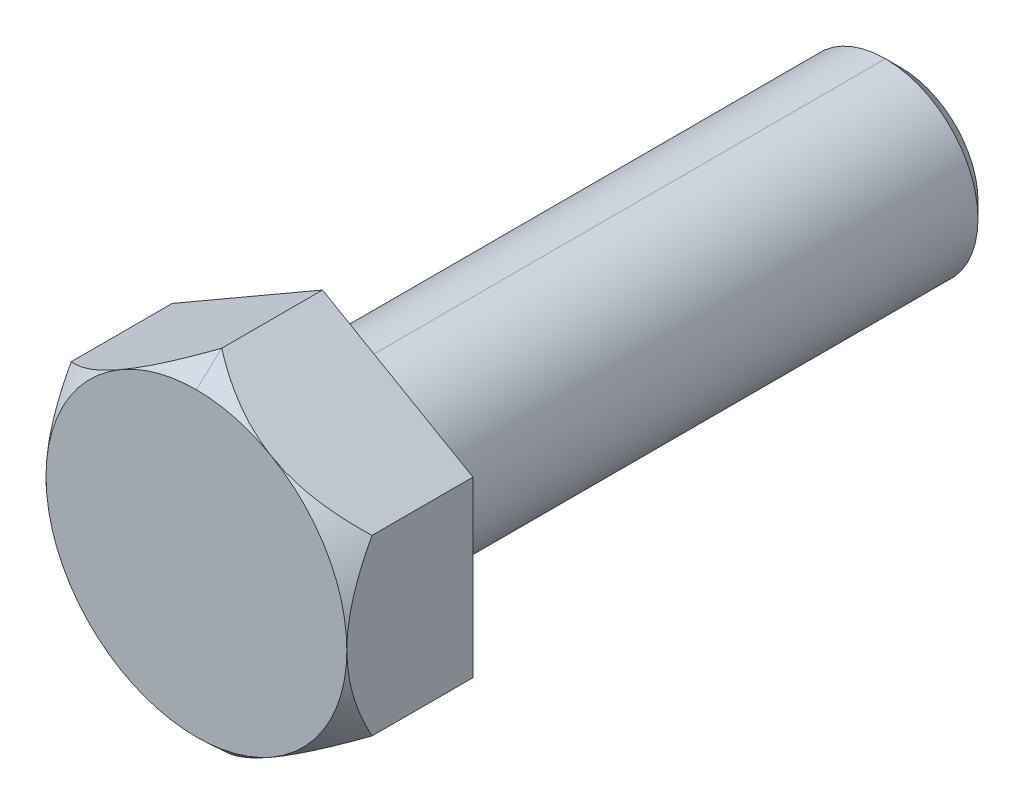
ISO-10303-21;
HEADER;
FILE_DESCRIPTION(('STEP AP214'),'2;1');
FILE_NAME('part.step','',(''),(''),'','','');
FILE_SCHEMA(('AUTOMOTIVE_DESIGN { 1 0 10303 214 1 1 1 1 }'));
ENDSEC;
DATA;
#1=APPLICATION_CONTEXT('core data for automotive mechanical design processes');
#2=APPLICATION_PROTOCOL_DEFINITION('international standard','automotive_design',2000,#1);
#3=PRODUCT_CONTEXT('',#1,'mechanical');
#4=PRODUCT('Part','Part','',(#3));
#5=PRODUCT_RELATED_PRODUCT_CATEGORY('part','',(#4));
#6=PRODUCT_DEFINITION_FORMATION('','',#4);
#7=PRODUCT_DEFINITION_CONTEXT('part definition',#1,'design');
#8=PRODUCT_DEFINITION('design','',#6,#7);
#9=PRODUCT_DEFINITION_SHAPE('','',#8);
#10=(LENGTH_UNIT() NAMED_UNIT(*) SI_UNIT(.MILLI.,.METRE.));
#11=(NAMED_UNIT(*) PLANE_ANGLE_UNIT() SI_UNIT($,.RADIAN.));
#12=(NAMED_UNIT(*) SI_UNIT($,.STERADIAN.) SOLID_ANGLE_UNIT());
#13=UNCERTAINTY_MEASURE_WITH_UNIT(LENGTH_MEASURE(1.E-05),#10,'distance_accuracy_value','');
#14=(GEOMETRIC_REPRESENTATION_CONTEXT(3) GLOBAL_UNCERTAINTY_ASSIGNED_CONTEXT((#13)) GLOBAL_UNIT_ASSIGNED_CONTEXT((#10,
#11,#12)) REPRESENTATION_CONTEXT('',''));
#15=CARTESIAN_POINT('',(0.,0.,0.));
#16=DIRECTION('',(0.,0.,1.));
#17=DIRECTION('',(1.,0.,0.));
#18=AXIS2_PLACEMENT_3D('',#15,#16,#17);
#19=CARTESIAN_POINT('',(0.,1.66171875,-25.));
#20=DIRECTION('',(0.,0.,-1.));
#21=DIRECTION('',(0.,-1.,0.));
#22=AXIS2_PLACEMENT_3D('',#19,#20,#21);
#23=PLANE('',#22);
#24=CARTESIAN_POINT('',(0.,0.,-25.));
#25=DIRECTION('',(0.,0.,-1.));
#26=DIRECTION('',(0.,1.,0.));
#27=AXIS2_PLACEMENT_3D('',#24,#25,#26);
#28=CIRCLE('',#27,3.3234375);
#29=CARTESIAN_POINT('',(0.,3.3234375,-25.));
#30=VERTEX_POINT('',#29);
#31=CARTESIAN_POINT('',(0.,-3.3234375,-25.));
#32=VERTEX_POINT('',#31);
#33=EDGE_CURVE('E250',#30,#32,#28,.T.);
#34=ORIENTED_EDGE('',*,*,#33,.T.);
#35=CARTESIAN_POINT('',(0.,0.,-25.));
#36=DIRECTION('',(0.,0.,-1.));
#37=DIRECTION('',(0.,1.,0.));
#38=AXIS2_PLACEMENT_3D('',#35,#36,#37);
#39=CIRCLE('',#38,3.3234375);
#40=EDGE_CURVE('E10',#32,#30,#39,.T.);
#41=ORIENTED_EDGE('',*,*,#40,.T.);
#42=EDGE_LOOP('',(#34,#41));
#43=FACE_BOUND('',#42,.T.);
#44=ADVANCED_FACE('F15',(#43),#23,.T.);
#45=CARTESIAN_POINT('',(0.,0.,-24.66171875));
#46=DIRECTION('',(0.,0.,1.));
#47=DIRECTION('',(0.,1.,0.));
#48=AXIS2_PLACEMENT_3D('',#45,#46,#47);
#49=CONICAL_SURFACE('',#48,3.66171875,0.785398163397449);
#50=DIRECTION('',(0.,-0.707106781186548,-0.707106781186547));
#51=VECTOR('',#50,1.);
#52=CARTESIAN_POINT('',(0.,3.66171875,-24.66171875));
#53=LINE('',#52,#51);
#54=CARTESIAN_POINT('',(0.,4.,-24.3234375));
#55=VERTEX_POINT('',#54);
#56=EDGE_CURVE('E247',#55,#30,#53,.T.);
#57=ORIENTED_EDGE('',*,*,#56,.T.);
#58=ORIENTED_EDGE('',*,*,#40,.F.);
#59=DIRECTION('',(0.,-0.707106781186548,0.707106781186547));
#60=VECTOR('',#59,1.);
#61=CARTESIAN_POINT('',(0.,-3.66171875,-24.66171875));
#62=LINE('',#61,#60);
#63=CARTESIAN_POINT('',(0.,-4.,-24.3234375));
#64=VERTEX_POINT('',#63);
#65=EDGE_CURVE('E19',#32,#64,#62,.T.);
#66=ORIENTED_EDGE('',*,*,#65,.T.);
#67=CARTESIAN_POINT('',(0.,0.,-24.3234375));
#68=DIRECTION('',(0.,0.,-1.));
#69=DIRECTION('',(0.,1.,0.));
#70=AXIS2_PLACEMENT_3D('',#67,#68,#69);
#71=CIRCLE('',#70,4.);
#72=EDGE_CURVE('E26',#64,#55,#71,.T.);
#73=ORIENTED_EDGE('',*,*,#72,.T.);
#74=EDGE_LOOP('',(#57,#58,#66,#73));
#75=FACE_BOUND('',#74,.T.);
#76=ADVANCED_FACE('F17',(#75),#49,.T.);
#77=CARTESIAN_POINT('',(0.,0.,-12.36171875));
#78=DIRECTION('',(0.,0.,-1.));
#79=DIRECTION('',(0.,1.,0.));
#80=AXIS2_PLACEMENT_3D('',#77,#78,#79);
#81=CYLINDRICAL_SURFACE('',#80,4.);
#82=DIRECTION('',(0.,0.,-1.));
#83=VECTOR('',#82,1.);
#84=CARTESIAN_POINT('',(0.,4.,-12.36171875));
#85=LINE('',#84,#83);
#86=CARTESIAN_POINT('',(0.,4.,-0.4));
#87=VERTEX_POINT('',#86);
#88=EDGE_CURVE('E200',#87,#55,#85,.T.);
#89=ORIENTED_EDGE('',*,*,#88,.T.);
#90=ORIENTED_EDGE('',*,*,#72,.F.);
#91=DIRECTION('',(0.,0.,1.));
#92=VECTOR('',#91,1.);
#93=CARTESIAN_POINT('',(0.,-4.,-12.36171875));
#94=LINE('',#93,#92);
#95=CARTESIAN_POINT('',(0.,-4.,-0.4));
#96=VERTEX_POINT('',#95);
#97=EDGE_CURVE('E180',#64,#96,#94,.T.);
#98=ORIENTED_EDGE('',*,*,#97,.T.);
#99=CARTESIAN_POINT('',(0.,0.,-0.4));
#100=DIRECTION('',(0.,0.,-1.));
#101=DIRECTION('',(0.,1.,0.));
#102=AXIS2_PLACEMENT_3D('',#99,#100,#101);
#103=CIRCLE('',#102,4.);
#104=CARTESIAN_POINT('',(-4.,0.,-0.4));
#105=VERTEX_POINT('',#104);
#106=EDGE_CURVE('E222',#96,#105,#103,.T.);
#107=ORIENTED_EDGE('',*,*,#106,.T.);
#108=CARTESIAN_POINT('',(0.,0.,-0.4));
#109=DIRECTION('',(0.,0.,-1.));
#110=DIRECTION('',(0.,1.,0.));
#111=AXIS2_PLACEMENT_3D('',#108,#109,#110);
#112=CIRCLE('',#111,4.);
#113=EDGE_CURVE('E335',#105,#87,#112,.T.);
#114=ORIENTED_EDGE('',*,*,#113,.T.);
#115=EDGE_LOOP('',(#89,#90,#98,#107,#114));
#116=FACE_BOUND('',#115,.T.);
#117=ADVANCED_FACE('F454',(#116),#81,.T.);
#118=CARTESIAN_POINT('',(0.,0.,-0.4));
#119=DIRECTION('',(0.,0.,-1.));
#120=DIRECTION('',(-1.,0.,0.));
#121=AXIS2_PLACEMENT_3D('',#118,#119,#120);
#122=TOROIDAL_SURFACE('',#121,4.4,0.4);
#123=CARTESIAN_POINT('',(4.4,0.,-0.4));
#124=DIRECTION('',(0.,-1.,0.));
#125=DIRECTION('',(1.,0.,0.));
#126=AXIS2_PLACEMENT_3D('',#123,#124,#125);
#127=CIRCLE('',#126,0.4);
#128=CARTESIAN_POINT('',(4.4,0.,0.));
#129=VERTEX_POINT('',#128);
#130=CARTESIAN_POINT('',(4.,0.,-0.4));
#131=VERTEX_POINT('',#130);
#132=EDGE_CURVE('E160',#129,#131,#127,.T.);
#133=ORIENTED_EDGE('',*,*,#132,.T.);
#134=CARTESIAN_POINT('',(0.,0.,-0.4));
#135=DIRECTION('',(0.,0.,-1.));
#136=DIRECTION('',(0.,1.,0.));
#137=AXIS2_PLACEMENT_3D('',#134,#135,#136);
#138=CIRCLE('',#137,4.);
#139=EDGE_CURVE('E197',#87,#131,#138,.T.);
#140=ORIENTED_EDGE('',*,*,#139,.F.);
#141=ORIENTED_EDGE('',*,*,#113,.F.);
#142=CARTESIAN_POINT('',(-4.4,0.,-0.4));
#143=DIRECTION('',(0.,-1.,0.));
#144=DIRECTION('',(-1.,0.,0.));
#145=AXIS2_PLACEMENT_3D('',#142,#143,#144);
#146=CIRCLE('',#145,0.4);
#147=CARTESIAN_POINT('',(-4.4,0.,0.));
#148=VERTEX_POINT('',#147);
#149=EDGE_CURVE('E173',#105,#148,#146,.T.);
#150=ORIENTED_EDGE('',*,*,#149,.T.);
#151=CARTESIAN_POINT('',(0.,0.,0.));
#152=DIRECTION('',(0.,0.,-1.));
#153=DIRECTION('',(0.,1.,0.));
#154=AXIS2_PLACEMENT_3D('',#151,#152,#153);
#155=CIRCLE('',#154,4.4);
#156=CARTESIAN_POINT('',(0.,4.4,0.));
#157=VERTEX_POINT('',#156);
#158=EDGE_CURVE('E39',#148,#157,#155,.T.);
#159=ORIENTED_EDGE('',*,*,#158,.T.);
#160=CARTESIAN_POINT('',(0.,0.,0.));
#161=DIRECTION('',(0.,0.,-1.));
#162=DIRECTION('',(0.,1.,0.));
#163=AXIS2_PLACEMENT_3D('',#160,#161,#162);
#164=CIRCLE('',#163,4.4);
#165=EDGE_CURVE('E155',#157,#129,#164,.T.);
#166=ORIENTED_EDGE('',*,*,#165,.T.);
#167=EDGE_LOOP('',(#133,#140,#141,#150,#159,#166));
#168=FACE_BOUND('',#167,.T.);
#169=ADVANCED_FACE('F157',(#168),#122,.F.);
#170=CARTESIAN_POINT('',(0.,0.,4.905));
#171=DIRECTION('',(0.,0.,-1.));
#172=DIRECTION('',(0.,1.,0.));
#173=AXIS2_PLACEMENT_3D('',#170,#171,#172);
#174=CONICAL_SURFACE('',#173,7.002775,0.745120275929383);
#175=DIRECTION('',(0.,0.678060218932267,-0.735006353374939));
#176=VECTOR('',#175,1.);
#177=CARTESIAN_POINT('',(0.,7.002775,4.905));
#178=LINE('',#177,#176);
#179=CARTESIAN_POINT('',(0.,6.5,5.45));
#180=VERTEX_POINT('',#179);
#181=CARTESIAN_POINT('',(0.,7.50554999999755,4.36));
#182=VERTEX_POINT('',#181);
#183=EDGE_CURVE('E217',#180,#182,#178,.T.);
#184=ORIENTED_EDGE('',*,*,#183,.T.);
#185=CARTESIAN_POINT('',(-6.49999393874435,3.75278024920015,4.36));
#186=CARTESIAN_POINT('',(-4.75832781303399,4.75833165571747,5.45));
#187=CARTESIAN_POINT('',(-3.25,5.62916512459885,5.45));
#188=CARTESIAN_POINT('',(-1.74167218696601,6.49999859348022,5.45));
#189=CARTESIAN_POINT('',(-6.0612556537463E-06,7.50554999999755,4.36));
#190=(BOUNDED_CURVE() B_SPLINE_CURVE(2,(#185,#186,#187,#188,#189),.UNSPECIFIED.,.F.,
.F.) B_SPLINE_CURVE_WITH_KNOTS((3,2,3),(0.,3.93923247027005,7.87846494054011),
.UNSPECIFIED.) CURVE() GEOMETRIC_REPRESENTATION_ITEM() RATIONAL_B_SPLINE_CURVE((1.,
1.03795471962896,1.,1.03795471962895,1.)) REPRESENTATION_ITEM(''));
#191=CARTESIAN_POINT('',(-3.25,5.62916512459885,5.45));
#192=VERTEX_POINT('',#191);
#193=EDGE_CURVE('E215',#192,#182,#190,.T.);
#194=ORIENTED_EDGE('',*,*,#193,.F.);
#195=CARTESIAN_POINT('',(0.,0.,5.45));
#196=DIRECTION('',(0.,0.,-1.));
#197=DIRECTION('',(0.,1.,0.));
#198=AXIS2_PLACEMENT_3D('',#195,#196,#197);
#199=CIRCLE('',#198,6.5);
#200=EDGE_CURVE('E332',#192,#180,#199,.T.);
#201=ORIENTED_EDGE('',*,*,#200,.T.);
#202=EDGE_LOOP('',(#184,#194,#201));
#203=FACE_BOUND('',#202,.T.);
#204=ADVANCED_FACE('F481',(#203),#174,.T.);
#205=CARTESIAN_POINT('',(0.,3.25,5.45));
#206=DIRECTION('',(0.,0.,1.));
#207=DIRECTION('',(0.,-1.,0.));
#208=AXIS2_PLACEMENT_3D('',#205,#206,#207);
#209=PLANE('',#208);
#210=ORIENTED_EDGE('',*,*,#200,.F.);
#211=CARTESIAN_POINT('',(0.,0.,5.45));
#212=DIRECTION('',(0.,0.,-1.));
#213=DIRECTION('',(0.,1.,0.));
#214=AXIS2_PLACEMENT_3D('',#211,#212,#213);
#215=CIRCLE('',#214,6.5);
#216=CARTESIAN_POINT('',(-6.5,0.,5.45));
#217=VERTEX_POINT('',#216);
#218=EDGE_CURVE('E288',#217,#192,#215,.T.);
#219=ORIENTED_EDGE('',*,*,#218,.F.);
#220=CARTESIAN_POINT('',(0.,0.,5.45));
#221=DIRECTION('',(0.,0.,-1.));
#222=DIRECTION('',(0.,1.,0.));
#223=AXIS2_PLACEMENT_3D('',#220,#221,#222);
#224=CIRCLE('',#223,6.5);
#225=CARTESIAN_POINT('',(-3.25,-5.62916512459885,5.45));
#226=VERTEX_POINT('',#225);
#227=EDGE_CURVE('E390',#226,#217,#224,.T.);
#228=ORIENTED_EDGE('',*,*,#227,.F.);
#229=CARTESIAN_POINT('',(0.,0.,5.45));
#230=DIRECTION('',(0.,0.,-1.));
#231=DIRECTION('',(0.,1.,0.));
#232=AXIS2_PLACEMENT_3D('',#229,#230,#231);
#233=CIRCLE('',#232,6.5);
#234=CARTESIAN_POINT('',(0.,-6.5,5.45));
#235=VERTEX_POINT('',#234);
#236=EDGE_CURVE('E367',#235,#226,#233,.T.);
#237=ORIENTED_EDGE('',*,*,#236,.F.);
#238=CARTESIAN_POINT('',(0.,0.,5.45));
#239=DIRECTION('',(0.,0.,-1.));
#240=DIRECTION('',(0.,1.,0.));
#241=AXIS2_PLACEMENT_3D('',#238,#239,#240);
#242=CIRCLE('',#241,6.5);
#243=CARTESIAN_POINT('',(3.25,-5.62916512459885,5.45));
#244=VERTEX_POINT('',#243);
#245=EDGE_CURVE('E280',#244,#235,#242,.T.);
#246=ORIENTED_EDGE('',*,*,#245,.F.);
#247=CARTESIAN_POINT('',(0.,0.,5.45));
#248=DIRECTION('',(0.,0.,-1.));
#249=DIRECTION('',(0.,1.,0.));
#250=AXIS2_PLACEMENT_3D('',#247,#248,#249);
#251=CIRCLE('',#250,6.5);
#252=CARTESIAN_POINT('',(6.5,0.,5.45));
#253=VERTEX_POINT('',#252);
#254=EDGE_CURVE('E293',#253,#244,#251,.T.);
#255=ORIENTED_EDGE('',*,*,#254,.F.);
#256=CARTESIAN_POINT('',(0.,0.,5.45));
#257=DIRECTION('',(0.,0.,-1.));
#258=DIRECTION('',(0.,1.,0.));
#259=AXIS2_PLACEMENT_3D('',#256,#257,#258);
#260=CIRCLE('',#259,6.5);
#261=CARTESIAN_POINT('',(3.25,5.62916512459885,5.45));
#262=VERTEX_POINT('',#261);
#263=EDGE_CURVE('E292',#262,#253,#260,.T.);
#264=ORIENTED_EDGE('',*,*,#263,.F.);
#265=CARTESIAN_POINT('',(0.,0.,5.45));
#266=DIRECTION('',(0.,0.,-1.));
#267=DIRECTION('',(0.,1.,0.));
#268=AXIS2_PLACEMENT_3D('',#265,#266,#267);
#269=CIRCLE('',#268,6.5);
#270=EDGE_CURVE('E221',#180,#262,#269,.T.);
#271=ORIENTED_EDGE('',*,*,#270,.F.);
#272=EDGE_LOOP('',(#210,#219,#228,#237,#246,#255,#264,#271));
#273=FACE_BOUND('',#272,.T.);
#274=ADVANCED_FACE('F384',(#273),#209,.T.);
#275=CARTESIAN_POINT('',(0.,0.,4.905));
#276=DIRECTION('',(0.,0.,-1.));
#277=DIRECTION('',(0.,1.,0.));
#278=AXIS2_PLACEMENT_3D('',#275,#276,#277);
#279=CONICAL_SURFACE('',#278,7.002775,0.745120275929383);
#280=CARTESIAN_POINT('',(6.0612556489286E-06,7.50554999999755,4.36));
#281=CARTESIAN_POINT('',(1.74167218696601,6.49999859348022,5.45));
#282=CARTESIAN_POINT('',(3.25,5.62916512459885,5.45));
#283=CARTESIAN_POINT('',(4.75832781303399,4.75833165571748,5.45));
#284=CARTESIAN_POINT('',(6.49999393874435,3.75278024920015,4.36));
#285=(BOUNDED_CURVE() B_SPLINE_CURVE(2,(#280,#281,#282,#283,#284),.UNSPECIFIED.,.F.,
.F.) B_SPLINE_CURVE_WITH_KNOTS((3,2,3),(0.,3.93923247027005,7.8784649405401),
.UNSPECIFIED.) CURVE() GEOMETRIC_REPRESENTATION_ITEM() RATIONAL_B_SPLINE_CURVE((1.,
1.03795471962894,1.,1.03795471962894,1.)) REPRESENTATION_ITEM(''));
#286=CARTESIAN_POINT('',(6.49999696937217,3.75277499999878,4.36));
#287=VERTEX_POINT('',#286);
#288=EDGE_CURVE('E207',#262,#287,#285,.T.);
#289=ORIENTED_EDGE('',*,*,#288,.F.);
#290=ORIENTED_EDGE('',*,*,#263,.T.);
#291=CARTESIAN_POINT('',(6.5,3.75276975079741,4.36));
#292=CARTESIAN_POINT('',(6.5,1.74166693776276,5.45));
#293=CARTESIAN_POINT('',(6.5,0.,5.45));
#294=CARTESIAN_POINT('',(6.50000000000001,-1.74166693776275,5.45));
#295=CARTESIAN_POINT('',(6.5,-3.7527697507974,4.36));
#296=(BOUNDED_CURVE() B_SPLINE_CURVE(2,(#291,#292,#293,#294,#295),.UNSPECIFIED.,.F.,
.F.) B_SPLINE_CURVE_WITH_KNOTS((3,2,3),(0.,3.93923247027006,7.87846494054011),
.UNSPECIFIED.) CURVE() GEOMETRIC_REPRESENTATION_ITEM() RATIONAL_B_SPLINE_CURVE((1.,
1.03795471962894,1.,1.03795471962895,1.)) REPRESENTATION_ITEM(''));
#297=EDGE_CURVE('E201',#287,#253,#296,.T.);
#298=ORIENTED_EDGE('',*,*,#297,.F.);
#299=EDGE_LOOP('',(#289,#290,#298));
#300=FACE_BOUND('',#299,.T.);
#301=ADVANCED_FACE('F380',(#300),#279,.T.);
#302=CARTESIAN_POINT('',(0.,0.,4.905));
#303=DIRECTION('',(0.,0.,-1.));
#304=DIRECTION('',(0.,1.,0.));
#305=AXIS2_PLACEMENT_3D('',#302,#303,#304);
#306=CONICAL_SURFACE('',#305,7.002775,0.745120275929383);
#307=CARTESIAN_POINT('',(-6.5,-3.7527697507974,4.36));
#308=CARTESIAN_POINT('',(-6.50000000000001,-1.74166693776275,5.45));
#309=CARTESIAN_POINT('',(-6.5,0.,5.45));
#310=CARTESIAN_POINT('',(-6.50000000000001,1.74166693776275,5.45));
#311=CARTESIAN_POINT('',(-6.5,3.7527697507974,4.36));
#312=(BOUNDED_CURVE() B_SPLINE_CURVE(2,(#307,#308,#309,#310,#311),.UNSPECIFIED.,.F.,
.F.) B_SPLINE_CURVE_WITH_KNOTS((3,2,3),(0.,3.93923247027005,7.8784649405401),
.UNSPECIFIED.) CURVE() GEOMETRIC_REPRESENTATION_ITEM() RATIONAL_B_SPLINE_CURVE((1.,
1.03795471962893,1.,1.03795471962893,1.)) REPRESENTATION_ITEM(''));
#313=CARTESIAN_POINT('',(-6.49999696937218,3.75277499999878,4.36));
#314=VERTEX_POINT('',#313);
#315=EDGE_CURVE('E321',#217,#314,#312,.T.);
#316=ORIENTED_EDGE('',*,*,#315,.F.);
#317=ORIENTED_EDGE('',*,*,#218,.T.);
#318=CARTESIAN_POINT('',(-6.49999393874435,3.75278024920015,4.36));
#319=CARTESIAN_POINT('',(-4.75832781303399,4.75833165571747,5.45));
#320=CARTESIAN_POINT('',(-3.25,5.62916512459885,5.45));
#321=CARTESIAN_POINT('',(-1.74167218696601,6.49999859348022,5.45));
#322=CARTESIAN_POINT('',(-6.0612556537463E-06,7.50554999999755,4.36));
#323=(BOUNDED_CURVE() B_SPLINE_CURVE(2,(#318,#319,#320,#321,#322),.UNSPECIFIED.,.F.,
.F.) B_SPLINE_CURVE_WITH_KNOTS((3,2,3),(0.,3.93923247027005,7.87846494054011),
.UNSPECIFIED.) CURVE() GEOMETRIC_REPRESENTATION_ITEM() RATIONAL_B_SPLINE_CURVE((1.,
1.03795471962896,1.,1.03795471962895,1.)) REPRESENTATION_ITEM(''));
#324=EDGE_CURVE('E287',#314,#192,#323,.T.);
#325=ORIENTED_EDGE('',*,*,#324,.F.);
#326=EDGE_LOOP('',(#316,#317,#325));
#327=FACE_BOUND('',#326,.T.);
#328=ADVANCED_FACE('F466',(#327),#306,.T.);
#329=CARTESIAN_POINT('',(0.,0.,4.905));
#330=DIRECTION('',(0.,0.,-1.));
#331=DIRECTION('',(0.,1.,0.));
#332=AXIS2_PLACEMENT_3D('',#329,#330,#331);
#333=CONICAL_SURFACE('',#332,7.002775,0.745120275929383);
#334=CARTESIAN_POINT('',(6.5,3.75276975079741,4.36));
#335=CARTESIAN_POINT('',(6.5,1.74166693776276,5.45));
#336=CARTESIAN_POINT('',(6.5,0.,5.45));
#337=CARTESIAN_POINT('',(6.50000000000001,-1.74166693776275,5.45));
#338=CARTESIAN_POINT('',(6.5,-3.7527697507974,4.36));
#339=(BOUNDED_CURVE() B_SPLINE_CURVE(2,(#334,#335,#336,#337,#338),.UNSPECIFIED.,.F.,
.F.) B_SPLINE_CURVE_WITH_KNOTS((3,2,3),(0.,3.93923247027006,7.87846494054011),
.UNSPECIFIED.) CURVE() GEOMETRIC_REPRESENTATION_ITEM() RATIONAL_B_SPLINE_CURVE((1.,
1.03795471962894,1.,1.03795471962895,1.)) REPRESENTATION_ITEM(''));
#340=CARTESIAN_POINT('',(6.49999696937217,-3.75277499999878,4.36));
#341=VERTEX_POINT('',#340);
#342=EDGE_CURVE('E196',#253,#341,#339,.T.);
#343=ORIENTED_EDGE('',*,*,#342,.F.);
#344=ORIENTED_EDGE('',*,*,#254,.T.);
#345=CARTESIAN_POINT('',(6.49999393874435,-3.75278024920015,4.36));
#346=CARTESIAN_POINT('',(4.75832781303399,-4.75833165571748,5.45));
#347=CARTESIAN_POINT('',(3.25,-5.62916512459885,5.45));
#348=CARTESIAN_POINT('',(1.74167218696601,-6.49999859348022,5.45));
#349=CARTESIAN_POINT('',(6.06125565273639E-06,-7.50554999999755,4.36));
#350=(BOUNDED_CURVE() B_SPLINE_CURVE(2,(#345,#346,#347,#348,#349),.UNSPECIFIED.,.F.,
.F.) B_SPLINE_CURVE_WITH_KNOTS((3,2,3),(0.,3.93923247027005,7.87846494054011),
.UNSPECIFIED.) CURVE() GEOMETRIC_REPRESENTATION_ITEM() RATIONAL_B_SPLINE_CURVE((1.,
1.03795471962894,1.,1.03795471962893,1.)) REPRESENTATION_ITEM(''));
#351=EDGE_CURVE('E260',#341,#244,#350,.T.);
#352=ORIENTED_EDGE('',*,*,#351,.F.);
#353=EDGE_LOOP('',(#343,#344,#352));
#354=FACE_BOUND('',#353,.T.);
#355=ADVANCED_FACE('F396',(#354),#333,.T.);
#356=CARTESIAN_POINT('',(0.,0.,4.905));
#357=DIRECTION('',(0.,0.,-1.));
#358=DIRECTION('',(0.,1.,0.));
#359=AXIS2_PLACEMENT_3D('',#356,#357,#358);
#360=CONICAL_SURFACE('',#359,7.002775,0.745120275929383);
#361=CARTESIAN_POINT('',(-6.5,-3.7527697507974,4.36));
#362=CARTESIAN_POINT('',(-6.50000000000001,-1.74166693776275,5.45));
#363=CARTESIAN_POINT('',(-6.5,0.,5.45));
#364=CARTESIAN_POINT('',(-6.50000000000001,1.74166693776275,5.45));
#365=CARTESIAN_POINT('',(-6.5,3.7527697507974,4.36));
#366=(BOUNDED_CURVE() B_SPLINE_CURVE(2,(#361,#362,#363,#364,#365),.UNSPECIFIED.,.F.,
.F.) B_SPLINE_CURVE_WITH_KNOTS((3,2,3),(0.,3.93923247027005,7.8784649405401),
.UNSPECIFIED.) CURVE() GEOMETRIC_REPRESENTATION_ITEM() RATIONAL_B_SPLINE_CURVE((1.,
1.03795471962893,1.,1.03795471962893,1.)) REPRESENTATION_ITEM(''));
#367=CARTESIAN_POINT('',(-6.49999696937217,-3.75277499999878,4.36));
#368=VERTEX_POINT('',#367);
#369=EDGE_CURVE('E229',#368,#217,#366,.T.);
#370=ORIENTED_EDGE('',*,*,#369,.F.);
#371=CARTESIAN_POINT('',(-6.06125564660671E-06,-7.50554999999755,4.36));
#372=CARTESIAN_POINT('',(-1.741672186966,-6.49999859348023,5.45));
#373=CARTESIAN_POINT('',(-3.25,-5.62916512459885,5.45));
#374=CARTESIAN_POINT('',(-4.75832781303399,-4.75833165571747,5.45));
#375=CARTESIAN_POINT('',(-6.49999393874435,-3.75278024920015,4.36));
#376=(BOUNDED_CURVE() B_SPLINE_CURVE(2,(#371,#372,#373,#374,#375),.UNSPECIFIED.,.F.,
.F.) B_SPLINE_CURVE_WITH_KNOTS((3,2,3),(0.,3.93923247027006,7.87846494054012),
.UNSPECIFIED.) CURVE() GEOMETRIC_REPRESENTATION_ITEM() RATIONAL_B_SPLINE_CURVE((1.,
1.03795471962894,1.,1.03795471962894,1.)) REPRESENTATION_ITEM(''));
#377=EDGE_CURVE('E238',#226,#368,#376,.T.);
#378=ORIENTED_EDGE('',*,*,#377,.F.);
#379=ORIENTED_EDGE('',*,*,#227,.T.);
#380=EDGE_LOOP('',(#370,#378,#379));
#381=FACE_BOUND('',#380,.T.);
#382=ADVANCED_FACE('F459',(#381),#360,.T.);
#383=CARTESIAN_POINT('',(0.,0.,4.905));
#384=DIRECTION('',(0.,0.,-1.));
#385=DIRECTION('',(0.,1.,0.));
#386=AXIS2_PLACEMENT_3D('',#383,#384,#385);
#387=CONICAL_SURFACE('',#386,7.002775,0.745120275929383);
#388=DIRECTION('',(0.,0.678060218932267,0.735006353374939));
#389=VECTOR('',#388,1.);
#390=CARTESIAN_POINT('',(0.,-7.002775,4.905));
#391=LINE('',#390,#389);
#392=CARTESIAN_POINT('',(0.,-7.50554999999755,4.36));
#393=VERTEX_POINT('',#392);
#394=EDGE_CURVE('E188',#393,#235,#391,.T.);
#395=ORIENTED_EDGE('',*,*,#394,.T.);
#396=ORIENTED_EDGE('',*,*,#236,.T.);
#397=CARTESIAN_POINT('',(-6.06125564660671E-06,-7.50554999999755,4.36));
#398=CARTESIAN_POINT('',(-1.741672186966,-6.49999859348023,5.45));
#399=CARTESIAN_POINT('',(-3.25,-5.62916512459885,5.45));
#400=CARTESIAN_POINT('',(-4.75832781303399,-4.75833165571747,5.45));
#401=CARTESIAN_POINT('',(-6.49999393874435,-3.75278024920015,4.36));
#402=(BOUNDED_CURVE() B_SPLINE_CURVE(2,(#397,#398,#399,#400,#401),.UNSPECIFIED.,.F.,
.F.) B_SPLINE_CURVE_WITH_KNOTS((3,2,3),(0.,3.93923247027006,7.87846494054012),
.UNSPECIFIED.) CURVE() GEOMETRIC_REPRESENTATION_ITEM() RATIONAL_B_SPLINE_CURVE((1.,
1.03795471962894,1.,1.03795471962894,1.)) REPRESENTATION_ITEM(''));
#403=EDGE_CURVE('E164',#393,#226,#402,.T.);
#404=ORIENTED_EDGE('',*,*,#403,.F.);
#405=EDGE_LOOP('',(#395,#396,#404));
#406=FACE_BOUND('',#405,.T.);
#407=ADVANCED_FACE('F462',(#406),#387,.T.);
#408=CARTESIAN_POINT('',(0.,5.952775,0.));
#409=DIRECTION('',(0.,0.,-1.));
#410=DIRECTION('',(0.,-1.,0.));
#411=AXIS2_PLACEMENT_3D('',#408,#409,#410);
#412=PLANE('',#411);
#413=ORIENTED_EDGE('',*,*,#165,.F.);
#414=ORIENTED_EDGE('',*,*,#158,.F.);
#415=CARTESIAN_POINT('',(0.,0.,0.));
#416=DIRECTION('',(0.,0.,-1.));
#417=DIRECTION('',(0.,1.,0.));
#418=AXIS2_PLACEMENT_3D('',#415,#416,#417);
#419=CIRCLE('',#418,4.4);
#420=EDGE_CURVE('E167',#129,#148,#419,.T.);
#421=ORIENTED_EDGE('',*,*,#420,.F.);
#422=EDGE_LOOP('',(#413,#414,#421));
#423=FACE_BOUND('',#422,.T.);
#424=DIRECTION('',(-0.866025403784439,0.5,0.));
#425=VECTOR('',#424,1.);
#426=CARTESIAN_POINT('',(1.96118640674677,6.37326199959885,0.));
#427=LINE('',#426,#425);
#428=CARTESIAN_POINT('',(6.49999696937217,3.75277499999878,0.));
#429=VERTEX_POINT('',#428);
#430=CARTESIAN_POINT('',(0.,7.50554999999755,0.));
#431=VERTEX_POINT('',#430);
#432=EDGE_CURVE('E216',#429,#431,#427,.T.);
#433=ORIENTED_EDGE('',*,*,#432,.F.);
#434=DIRECTION('',(0.,1.,0.));
#435=VECTOR('',#434,1.);
#436=CARTESIAN_POINT('',(6.5,2.9763875,0.));
#437=LINE('',#436,#435);
#438=CARTESIAN_POINT('',(6.49999696937217,-3.75277499999878,0.));
#439=VERTEX_POINT('',#438);
#440=EDGE_CURVE('E191',#439,#429,#437,.T.);
#441=ORIENTED_EDGE('',*,*,#440,.F.);
#442=DIRECTION('',(0.866025403784439,0.5,0.));
#443=VECTOR('',#442,1.);
#444=CARTESIAN_POINT('',(4.53881359325323,-4.88506824959885,0.));
#445=LINE('',#444,#443);
#446=CARTESIAN_POINT('',(0.,-7.50554999999755,0.));
#447=VERTEX_POINT('',#446);
#448=EDGE_CURVE('E279',#447,#439,#445,.T.);
#449=ORIENTED_EDGE('',*,*,#448,.F.);
#450=DIRECTION('',(0.866025403784439,-0.5,0.));
#451=VECTOR('',#450,1.);
#452=CARTESIAN_POINT('',(-4.53881359325323,-4.88506824959885,0.));
#453=LINE('',#452,#451);
#454=CARTESIAN_POINT('',(-6.49999696937217,-3.75277499999878,0.));
#455=VERTEX_POINT('',#454);
#456=EDGE_CURVE('E312',#455,#447,#453,.T.);
#457=ORIENTED_EDGE('',*,*,#456,.F.);
#458=DIRECTION('',(0.,-1.,0.));
#459=VECTOR('',#458,1.);
#460=CARTESIAN_POINT('',(-6.5,2.9763875,0.));
#461=LINE('',#460,#459);
#462=CARTESIAN_POINT('',(-6.49999696937218,3.75277499999878,0.));
#463=VERTEX_POINT('',#462);
#464=EDGE_CURVE('E328',#463,#455,#461,.T.);
#465=ORIENTED_EDGE('',*,*,#464,.F.);
#466=DIRECTION('',(-0.866025403784439,-0.5,0.));
#467=VECTOR('',#466,1.);
#468=CARTESIAN_POINT('',(-1.96118640674677,6.37326199959885,0.));
#469=LINE('',#468,#467);
#470=EDGE_CURVE('E255',#431,#463,#469,.T.);
#471=ORIENTED_EDGE('',*,*,#470,.F.);
#472=EDGE_LOOP('',(#433,#441,#449,#457,#465,#471));
#473=FACE_BOUND('',#472,.T.);
#474=ADVANCED_FACE('F168',(#423,#473),#412,.T.);
#475=CARTESIAN_POINT('',(-3.25,-5.62916512459885,5.45));
#476=DIRECTION('',(-0.5,-0.866025403784439,0.));
#477=DIRECTION('',(-0.866025403784439,0.5,0.));
#478=AXIS2_PLACEMENT_3D('',#475,#476,#477);
#479=PLANE('',#478);
#480=ORIENTED_EDGE('',*,*,#377,.T.);
#481=DIRECTION('',(0.,0.,-1.));
#482=VECTOR('',#481,1.);
#483=CARTESIAN_POINT('',(-6.49999393874435,-3.75278024920015,2.18));
#484=LINE('',#483,#482);
#485=EDGE_CURVE('E239',#368,#455,#484,.T.);
#486=ORIENTED_EDGE('',*,*,#485,.T.);
#487=ORIENTED_EDGE('',*,*,#456,.T.);
#488=DIRECTION('',(0.,0.,-1.));
#489=VECTOR('',#488,1.);
#490=CARTESIAN_POINT('',(6.06125565103506E-06,-7.50554999999755,2.18));
#491=LINE('',#490,#489);
#492=EDGE_CURVE('E275',#393,#447,#491,.T.);
#493=ORIENTED_EDGE('',*,*,#492,.F.);
#494=ORIENTED_EDGE('',*,*,#403,.T.);
#495=EDGE_LOOP('',(#480,#486,#487,#493,#494));
#496=FACE_BOUND('',#495,.T.);
#497=ADVANCED_FACE('F484',(#496),#479,.T.);
#498=CARTESIAN_POINT('',(-6.5,0.,5.45));
#499=DIRECTION('',(-1.,0.,0.));
#500=DIRECTION('',(0.,0.,1.));
#501=AXIS2_PLACEMENT_3D('',#498,#499,#500);
#502=PLANE('',#501);
#503=ORIENTED_EDGE('',*,*,#315,.T.);
#504=DIRECTION('',(0.,0.,1.));
#505=VECTOR('',#504,1.);
#506=CARTESIAN_POINT('',(-6.49999393874435,3.75278024920014,2.18));
#507=LINE('',#506,#505);
#508=EDGE_CURVE('E259',#463,#314,#507,.T.);
#509=ORIENTED_EDGE('',*,*,#508,.F.);
#510=ORIENTED_EDGE('',*,*,#464,.T.);
#511=ORIENTED_EDGE('',*,*,#485,.F.);
#512=ORIENTED_EDGE('',*,*,#369,.T.);
#513=EDGE_LOOP('',(#503,#509,#510,#511,#512));
#514=FACE_BOUND('',#513,.T.);
#515=ADVANCED_FACE('F473',(#514),#502,.T.);
#516=CARTESIAN_POINT('',(-3.25,5.62916512459885,5.45));
#517=DIRECTION('',(-0.5,0.866025403784439,0.));
#518=DIRECTION('',(0.,0.,1.));
#519=AXIS2_PLACEMENT_3D('',#516,#517,#518);
#520=PLANE('',#519);
#521=ORIENTED_EDGE('',*,*,#193,.T.);
#522=DIRECTION('',(0.,0.,1.));
#523=VECTOR('',#522,1.);
#524=CARTESIAN_POINT('',(6.06125564659417E-06,7.50554999999755,2.18));
#525=LINE('',#524,#523);
#526=EDGE_CURVE('E208',#431,#182,#525,.T.);
#527=ORIENTED_EDGE('',*,*,#526,.F.);
#528=ORIENTED_EDGE('',*,*,#470,.T.);
#529=ORIENTED_EDGE('',*,*,#508,.T.);
#530=ORIENTED_EDGE('',*,*,#324,.T.);
#531=EDGE_LOOP('',(#521,#527,#528,#529,#530));
#532=FACE_BOUND('',#531,.T.);
#533=ADVANCED_FACE('F470',(#532),#520,.T.);
#534=CARTESIAN_POINT('',(3.25,5.62916512459885,5.45));
#535=DIRECTION('',(0.5,0.866025403784439,0.));
#536=DIRECTION('',(0.,0.,-1.));
#537=AXIS2_PLACEMENT_3D('',#534,#535,#536);
#538=PLANE('',#537);
#539=ORIENTED_EDGE('',*,*,#288,.T.);
#540=DIRECTION('',(0.,0.,1.));
#541=VECTOR('',#540,1.);
#542=CARTESIAN_POINT('',(6.5,3.75276975079741,2.18));
#543=LINE('',#542,#541);
#544=EDGE_CURVE('E195',#429,#287,#543,.T.);
#545=ORIENTED_EDGE('',*,*,#544,.F.);
#546=ORIENTED_EDGE('',*,*,#432,.T.);
#547=ORIENTED_EDGE('',*,*,#526,.T.);
#548=CARTESIAN_POINT('',(6.0612556489286E-06,7.50554999999755,4.36));
#549=CARTESIAN_POINT('',(1.74167218696601,6.49999859348022,5.45));
#550=CARTESIAN_POINT('',(3.25,5.62916512459885,5.45));
#551=CARTESIAN_POINT('',(4.75832781303399,4.75833165571748,5.45));
#552=CARTESIAN_POINT('',(6.49999393874435,3.75278024920015,4.36));
#553=(BOUNDED_CURVE() B_SPLINE_CURVE(2,(#548,#549,#550,#551,#552),.UNSPECIFIED.,.F.,
.F.) B_SPLINE_CURVE_WITH_KNOTS((3,2,3),(0.,3.93923247027005,7.8784649405401),
.UNSPECIFIED.) CURVE() GEOMETRIC_REPRESENTATION_ITEM() RATIONAL_B_SPLINE_CURVE((1.,
1.03795471962894,1.,1.03795471962894,1.)) REPRESENTATION_ITEM(''));
#554=EDGE_CURVE('E223',#182,#262,#553,.T.);
#555=ORIENTED_EDGE('',*,*,#554,.T.);
#556=EDGE_LOOP('',(#539,#545,#546,#547,#555));
#557=FACE_BOUND('',#556,.T.);
#558=ADVANCED_FACE('F469',(#557),#538,.T.);
#559=CARTESIAN_POINT('',(6.5,0.,5.45));
#560=DIRECTION('',(1.,0.,0.));
#561=DIRECTION('',(0.,1.,0.));
#562=AXIS2_PLACEMENT_3D('',#559,#560,#561);
#563=PLANE('',#562);
#564=ORIENTED_EDGE('',*,*,#342,.T.);
#565=DIRECTION('',(0.,0.,1.));
#566=VECTOR('',#565,1.);
#567=CARTESIAN_POINT('',(6.49999393874435,-3.75278024920015,2.18));
#568=LINE('',#567,#566);
#569=EDGE_CURVE('E265',#439,#341,#568,.T.);
#570=ORIENTED_EDGE('',*,*,#569,.F.);
#571=ORIENTED_EDGE('',*,*,#440,.T.);
#572=ORIENTED_EDGE('',*,*,#544,.T.);
#573=ORIENTED_EDGE('',*,*,#297,.T.);
#574=EDGE_LOOP('',(#564,#570,#571,#572,#573));
#575=FACE_BOUND('',#574,.T.);
#576=ADVANCED_FACE('F393',(#575),#563,.T.);
#577=CARTESIAN_POINT('',(3.25,-5.62916512459885,5.45));
#578=DIRECTION('',(0.5,-0.866025403784439,0.));
#579=DIRECTION('',(0.,0.,-1.));
#580=AXIS2_PLACEMENT_3D('',#577,#578,#579);
#581=PLANE('',#580);
#582=CARTESIAN_POINT('',(6.49999393874435,-3.75278024920015,4.36));
#583=CARTESIAN_POINT('',(4.75832781303399,-4.75833165571748,5.45));
#584=CARTESIAN_POINT('',(3.25,-5.62916512459885,5.45));
#585=CARTESIAN_POINT('',(1.74167218696601,-6.49999859348022,5.45));
#586=CARTESIAN_POINT('',(6.06125565273639E-06,-7.50554999999755,4.36));
#587=(BOUNDED_CURVE() B_SPLINE_CURVE(2,(#582,#583,#584,#585,#586),.UNSPECIFIED.,.F.,
.F.) B_SPLINE_CURVE_WITH_KNOTS((3,2,3),(0.,3.93923247027005,7.87846494054011),
.UNSPECIFIED.) CURVE() GEOMETRIC_REPRESENTATION_ITEM() RATIONAL_B_SPLINE_CURVE((1.,
1.03795471962894,1.,1.03795471962893,1.)) REPRESENTATION_ITEM(''));
#588=EDGE_CURVE('E307',#244,#393,#587,.T.);
#589=ORIENTED_EDGE('',*,*,#588,.T.);
#590=ORIENTED_EDGE('',*,*,#492,.T.);
#591=ORIENTED_EDGE('',*,*,#448,.T.);
#592=ORIENTED_EDGE('',*,*,#569,.T.);
#593=ORIENTED_EDGE('',*,*,#351,.T.);
#594=EDGE_LOOP('',(#589,#590,#591,#592,#593));
#595=FACE_BOUND('',#594,.T.);
#596=ADVANCED_FACE('F457',(#595),#581,.T.);
#597=CARTESIAN_POINT('',(0.,0.,4.905));
#598=DIRECTION('',(0.,0.,-1.));
#599=DIRECTION('',(0.,1.,0.));
#600=AXIS2_PLACEMENT_3D('',#597,#598,#599);
#601=CONICAL_SURFACE('',#600,7.002775,0.745120275929383);
#602=ORIENTED_EDGE('',*,*,#394,.F.);
#603=ORIENTED_EDGE('',*,*,#588,.F.);
#604=ORIENTED_EDGE('',*,*,#245,.T.);
#605=EDGE_LOOP('',(#602,#603,#604));
#606=FACE_BOUND('',#605,.T.);
#607=ADVANCED_FACE('F504',(#606),#601,.T.);
#608=CARTESIAN_POINT('',(0.,0.,4.905));
#609=DIRECTION('',(0.,0.,-1.));
#610=DIRECTION('',(0.,1.,0.));
#611=AXIS2_PLACEMENT_3D('',#608,#609,#610);
#612=CONICAL_SURFACE('',#611,7.002775,0.745120275929383);
#613=ORIENTED_EDGE('',*,*,#183,.F.);
#614=ORIENTED_EDGE('',*,*,#270,.T.);
#615=ORIENTED_EDGE('',*,*,#554,.F.);
#616=EDGE_LOOP('',(#613,#614,#615));
#617=FACE_BOUND('',#616,.T.);
#618=ADVANCED_FACE('F478',(#617),#612,.T.);
#619=CARTESIAN_POINT('',(0.,0.,-0.4));
#620=DIRECTION('',(0.,0.,-1.));
#621=DIRECTION('',(-1.,0.,0.));
#622=AXIS2_PLACEMENT_3D('',#619,#620,#621);
#623=TOROIDAL_SURFACE('',#622,4.4,0.4);
#624=ORIENTED_EDGE('',*,*,#132,.F.);
#625=ORIENTED_EDGE('',*,*,#420,.T.);
#626=ORIENTED_EDGE('',*,*,#149,.F.);
#627=ORIENTED_EDGE('',*,*,#106,.F.);
#628=CARTESIAN_POINT('',(0.,0.,-0.4));
#629=DIRECTION('',(0.,0.,-1.));
#630=DIRECTION('',(0.,1.,0.));
#631=AXIS2_PLACEMENT_3D('',#628,#629,#630);
#632=CIRCLE('',#631,4.);
#633=EDGE_CURVE('E177',#131,#96,#632,.T.);
#634=ORIENTED_EDGE('',*,*,#633,.F.);
#635=EDGE_LOOP('',(#624,#625,#626,#627,#634));
#636=FACE_BOUND('',#635,.T.);
#637=ADVANCED_FACE('F175',(#636),#623,.F.);
#638=CARTESIAN_POINT('',(0.,0.,-12.36171875));
#639=DIRECTION('',(0.,0.,-1.));
#640=DIRECTION('',(0.,1.,0.));
#641=AXIS2_PLACEMENT_3D('',#638,#639,#640);
#642=CYLINDRICAL_SURFACE('',#641,4.);
#643=ORIENTED_EDGE('',*,*,#88,.F.);
#644=ORIENTED_EDGE('',*,*,#139,.T.);
#645=ORIENTED_EDGE('',*,*,#633,.T.);
#646=ORIENTED_EDGE('',*,*,#97,.F.);
#647=CARTESIAN_POINT('',(0.,0.,-24.3234375));
#648=DIRECTION('',(0.,0.,-1.));
#649=DIRECTION('',(0.,1.,0.));
#650=AXIS2_PLACEMENT_3D('',#647,#648,#649);
#651=CIRCLE('',#650,4.);
#652=EDGE_CURVE('E240',#55,#64,#651,.T.);
#653=ORIENTED_EDGE('',*,*,#652,.F.);
#654=EDGE_LOOP('',(#643,#644,#645,#646,#653));
#655=FACE_BOUND('',#654,.T.);
#656=ADVANCED_FACE('F477',(#655),#642,.T.);
#657=CARTESIAN_POINT('',(0.,0.,-24.66171875));
#658=DIRECTION('',(0.,0.,1.));
#659=DIRECTION('',(0.,1.,0.));
#660=AXIS2_PLACEMENT_3D('',#657,#658,#659);
#661=CONICAL_SURFACE('',#660,3.66171875,0.785398163397449);
#662=ORIENTED_EDGE('',*,*,#56,.F.);
#663=ORIENTED_EDGE('',*,*,#652,.T.);
#664=ORIENTED_EDGE('',*,*,#65,.F.);
#665=ORIENTED_EDGE('',*,*,#33,.F.);
#666=EDGE_LOOP('',(#662,#663,#664,#665));
#667=FACE_BOUND('',#666,.T.);
#668=ADVANCED_FACE('F444',(#667),#661,.T.);
#669=CLOSED_SHELL('',(#44,#76,#117,#169,#204,#274,#301,#328,#355,#382,#407,#474,#497,#515,#533,
#558,#576,#596,#607,#618,#637,#656,#668));
#670=MANIFOLD_SOLID_BREP('B1',#669);
#671=ADVANCED_BREP_SHAPE_REPRESENTATION('',(#18,#670),#14);
#672=SHAPE_DEFINITION_REPRESENTATION(#9,#671);
ENDSEC;
END-ISO-10303-21;
